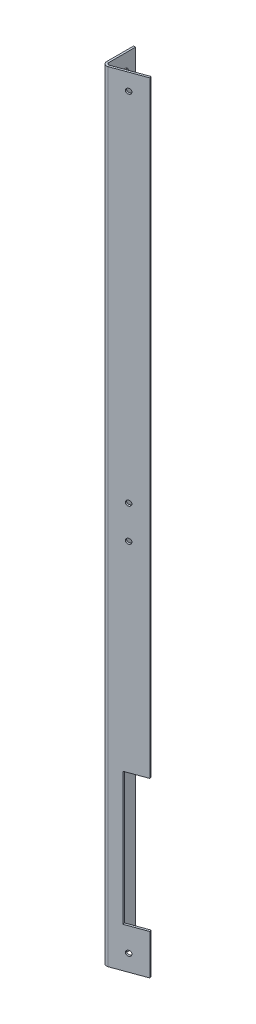
ISO-10303-21;
HEADER;
FILE_DESCRIPTION(('STEP AP214'),'2;1');
FILE_NAME('part.step','',(''),(''),'','','');
FILE_SCHEMA(('AUTOMOTIVE_DESIGN { 1 0 10303 214 1 1 1 1 }'));
ENDSEC;
DATA;
#1=APPLICATION_CONTEXT('core data for automotive mechanical design processes');
#2=APPLICATION_PROTOCOL_DEFINITION('international standard','automotive_design',2000,#1);
#3=PRODUCT_CONTEXT('',#1,'mechanical');
#4=PRODUCT('Part','Part','',(#3));
#5=PRODUCT_RELATED_PRODUCT_CATEGORY('part','',(#4));
#6=PRODUCT_DEFINITION_FORMATION('','',#4);
#7=PRODUCT_DEFINITION_CONTEXT('part definition',#1,'design');
#8=PRODUCT_DEFINITION('design','',#6,#7);
#9=PRODUCT_DEFINITION_SHAPE('','',#8);
#10=(LENGTH_UNIT() NAMED_UNIT(*) SI_UNIT(.MILLI.,.METRE.));
#11=(NAMED_UNIT(*) PLANE_ANGLE_UNIT() SI_UNIT($,.RADIAN.));
#12=(NAMED_UNIT(*) SI_UNIT($,.STERADIAN.) SOLID_ANGLE_UNIT());
#13=UNCERTAINTY_MEASURE_WITH_UNIT(LENGTH_MEASURE(1.E-05),#10,'distance_accuracy_value','');
#14=(GEOMETRIC_REPRESENTATION_CONTEXT(3) GLOBAL_UNCERTAINTY_ASSIGNED_CONTEXT((#13)) GLOBAL_UNIT_ASSIGNED_CONTEXT((#10,
#11,#12)) REPRESENTATION_CONTEXT('',''));
#15=CARTESIAN_POINT('',(0.,0.,0.));
#16=DIRECTION('',(0.,0.,1.));
#17=DIRECTION('',(1.,0.,0.));
#18=AXIS2_PLACEMENT_3D('',#15,#16,#17);
#19=CARTESIAN_POINT('',(2.49294013807537,0.,-1.4533113574662));
#20=DIRECTION('',(-0.342020143325673,0.,-0.939692620785907));
#21=DIRECTION('',(-0.939692620785907,0.,0.342020143325673));
#22=AXIS2_PLACEMENT_3D('',#19,#20,#21);
#23=PLANE('',#22);
#24=CARTESIAN_POINT('',(14.0511593737421,-12.7,-5.66015912037198));
#25=DIRECTION('',(0.342020143325673,0.,0.939692620785907));
#26=DIRECTION('',(0.939692620785907,0.,-0.342020143325673));
#27=AXIS2_PLACEMENT_3D('',#24,#25,#26);
#28=CIRCLE('',#27,2.);
#29=CARTESIAN_POINT('',(15.9305446153139,-12.7,-6.34419940702333));
#30=VERTEX_POINT('',#29);
#31=EDGE_CURVE('E320',#30,#30,#28,.T.);
#32=ORIENTED_EDGE('',*,*,#31,.F.);
#33=EDGE_LOOP('',(#32));
#34=FACE_BOUND('',#33,.T.);
#35=CARTESIAN_POINT('',(14.0511593737421,-287.3,-5.66015912037199));
#36=DIRECTION('',(0.342020143325673,0.,0.939692620785907));
#37=DIRECTION('',(0.939692620785907,0.,-0.342020143325673));
#38=AXIS2_PLACEMENT_3D('',#35,#36,#37);
#39=CIRCLE('',#38,2.);
#40=CARTESIAN_POINT('',(15.9305446153139,-287.3,-6.34419940702333));
#41=VERTEX_POINT('',#40);
#42=EDGE_CURVE('E327',#41,#41,#39,.T.);
#43=ORIENTED_EDGE('',*,*,#42,.F.);
#44=EDGE_LOOP('',(#43));
#45=FACE_BOUND('',#44,.T.);
#46=CARTESIAN_POINT('',(14.0511593737421,12.7,-5.66015912037198));
#47=DIRECTION('',(0.342020143325673,0.,0.939692620785907));
#48=DIRECTION('',(0.939692620785907,0.,-0.342020143325673));
#49=AXIS2_PLACEMENT_3D('',#46,#47,#48);
#50=CIRCLE('',#49,2.);
#51=CARTESIAN_POINT('',(15.9305446153139,12.7,-6.34419940702333));
#52=VERTEX_POINT('',#51);
#53=EDGE_CURVE('E340',#52,#52,#50,.T.);
#54=ORIENTED_EDGE('',*,*,#53,.F.);
#55=EDGE_LOOP('',(#54));
#56=FACE_BOUND('',#55,.T.);
#57=CARTESIAN_POINT('',(14.0511593737421,287.3,-5.66015912037199));
#58=DIRECTION('',(0.342020143325673,0.,0.939692620785907));
#59=DIRECTION('',(0.939692620785907,0.,-0.342020143325673));
#60=AXIS2_PLACEMENT_3D('',#57,#58,#59);
#61=CIRCLE('',#60,2.);
#62=CARTESIAN_POINT('',(15.9305446153139,287.3,-6.34419940702333));
#63=VERTEX_POINT('',#62);
#64=EDGE_CURVE('E343',#63,#63,#61,.T.);
#65=ORIENTED_EDGE('',*,*,#64,.F.);
#66=EDGE_LOOP('',(#65));
#67=FACE_BOUND('',#66,.T.);
#68=DIRECTION('',(0.939692620785907,0.,-0.342020143325673));
#69=VECTOR('',#68,1.);
#70=CARTESIAN_POINT('',(10.9501737251485,-167.,-4.53149264739725));
#71=LINE('',#70,#69);
#72=CARTESIAN_POINT('',(10.9501737251485,-167.,-4.53149264739725));
#73=VERTEX_POINT('',#72);
#74=CARTESIAN_POINT('',(25.9852556577231,-167.,-10.003814940608));
#75=VERTEX_POINT('',#74);
#76=EDGE_CURVE('E195',#73,#75,#71,.T.);
#77=ORIENTED_EDGE('',*,*,#76,.T.);
#78=DIRECTION('',(0.,-1.,0.));
#79=VECTOR('',#78,1.);
#80=CARTESIAN_POINT('',(25.985255657723,-300.,-10.003814940608));
#81=LINE('',#80,#79);
#82=CARTESIAN_POINT('',(25.985255657723,300.,-10.003814940608));
#83=VERTEX_POINT('',#82);
#84=EDGE_CURVE('E204',#83,#75,#81,.T.);
#85=ORIENTED_EDGE('',*,*,#84,.F.);
#86=DIRECTION('',(0.939692620785907,0.,-0.342020143325673));
#87=VECTOR('',#86,1.);
#88=CARTESIAN_POINT('',(25.985255657723,300.,-10.003814940608));
#89=LINE('',#88,#87);
#90=CARTESIAN_POINT('',(2.52606042997701,300.,-1.46536615786861));
#91=VERTEX_POINT('',#90);
#92=EDGE_CURVE('E93',#91,#83,#89,.T.);
#93=ORIENTED_EDGE('',*,*,#92,.F.);
#94=DIRECTION('',(0.,-1.,0.));
#95=VECTOR('',#94,1.);
#96=CARTESIAN_POINT('',(2.52606042997702,0.,-1.46536615786861));
#97=LINE('',#96,#95);
#98=CARTESIAN_POINT('',(2.52606042997702,-300.,-1.46536615786861));
#99=VERTEX_POINT('',#98);
#100=EDGE_CURVE('E226',#91,#99,#97,.T.);
#101=ORIENTED_EDGE('',*,*,#100,.T.);
#102=DIRECTION('',(-0.939692620785907,0.,0.342020143325673));
#103=VECTOR('',#102,1.);
#104=CARTESIAN_POINT('',(25.985255657723,-300.,-10.003814940608));
#105=LINE('',#104,#103);
#106=CARTESIAN_POINT('',(25.985255657723,-300.,-10.003814940608));
#107=VERTEX_POINT('',#106);
#108=EDGE_CURVE('E235',#107,#99,#105,.T.);
#109=ORIENTED_EDGE('',*,*,#108,.F.);
#110=CARTESIAN_POINT('',(25.9852556577231,-269.,-10.003814940608));
#111=VERTEX_POINT('',#110);
#112=EDGE_CURVE('E409',#111,#107,#81,.T.);
#113=ORIENTED_EDGE('',*,*,#112,.F.);
#114=DIRECTION('',(0.939692620785907,0.,-0.342020143325673));
#115=VECTOR('',#114,1.);
#116=CARTESIAN_POINT('',(10.9501737251485,-269.,-4.53149264739725));
#117=LINE('',#116,#115);
#118=CARTESIAN_POINT('',(10.9501737251485,-269.,-4.53149264739725));
#119=VERTEX_POINT('',#118);
#120=EDGE_CURVE('E391',#119,#111,#117,.T.);
#121=ORIENTED_EDGE('',*,*,#120,.F.);
#122=DIRECTION('',(0.,-1.,0.));
#123=VECTOR('',#122,1.);
#124=CARTESIAN_POINT('',(10.9501737251485,-167.,-4.53149264739725));
#125=LINE('',#124,#123);
#126=EDGE_CURVE('E388',#73,#119,#125,.T.);
#127=ORIENTED_EDGE('',*,*,#126,.F.);
#128=EDGE_LOOP('',(#77,#85,#93,#101,#109,#113,#121,#127));
#129=FACE_BOUND('',#128,.T.);
#130=ADVANCED_FACE('F88',(#34,#45,#56,#67,#129),#23,.F.);
#131=CARTESIAN_POINT('',(25.985255657723,-300.,-10.003814940608));
#132=DIRECTION('',(0.939692620785907,0.,-0.342020143325673));
#133=DIRECTION('',(0.,-1.,0.));
#134=AXIS2_PLACEMENT_3D('',#131,#132,#133);
#135=PLANE('',#134);
#136=ORIENTED_EDGE('',*,*,#84,.T.);
#137=DIRECTION('',(0.342020143325673,0.,0.939692620785907));
#138=VECTOR('',#137,1.);
#139=CARTESIAN_POINT('',(17.9499721650579,-167.,-32.0805748956216));
#140=LINE('',#139,#138);
#141=CARTESIAN_POINT('',(25.4722254427345,-167.,-11.4133538717869));
#142=VERTEX_POINT('',#141);
#143=EDGE_CURVE('E184',#142,#75,#140,.T.);
#144=ORIENTED_EDGE('',*,*,#143,.F.);
#145=DIRECTION('',(0.,-1.,0.));
#146=VECTOR('',#145,1.);
#147=CARTESIAN_POINT('',(25.4722254427345,-300.,-11.4133538717869));
#148=LINE('',#147,#146);
#149=CARTESIAN_POINT('',(25.4722254427345,300.,-11.4133538717869));
#150=VERTEX_POINT('',#149);
#151=EDGE_CURVE('E199',#150,#142,#148,.T.);
#152=ORIENTED_EDGE('',*,*,#151,.F.);
#153=DIRECTION('',(-0.342020143325673,0.,-0.939692620785907));
#154=VECTOR('',#153,1.);
#155=CARTESIAN_POINT('',(25.985255657723,300.,-10.003814940608));
#156=LINE('',#155,#154);
#157=EDGE_CURVE('E230',#83,#150,#156,.T.);
#158=ORIENTED_EDGE('',*,*,#157,.F.);
#159=EDGE_LOOP('',(#136,#144,#152,#158));
#160=FACE_BOUND('',#159,.T.);
#161=ADVANCED_FACE('F196',(#160),#135,.T.);
#162=CARTESIAN_POINT('',(1.97990992308686,0.,-2.86285028864506));
#163=DIRECTION('',(-0.342020143325673,0.,-0.939692620785907));
#164=DIRECTION('',(-0.939692620785907,0.,0.342020143325673));
#165=AXIS2_PLACEMENT_3D('',#162,#163,#164);
#166=PLANE('',#165);
#167=CARTESIAN_POINT('',(13.5381291587536,287.3,-7.06969805155085));
#168=DIRECTION('',(-0.342020143325673,0.,-0.939692620785907));
#169=DIRECTION('',(-0.939692620785907,0.,0.342020143325673));
#170=AXIS2_PLACEMENT_3D('',#167,#168,#169);
#171=CIRCLE('',#170,2.);
#172=CARTESIAN_POINT('',(11.6587439171817,287.3,-6.3856577648995));
#173=VERTEX_POINT('',#172);
#174=EDGE_CURVE('E342',#173,#173,#171,.T.);
#175=ORIENTED_EDGE('',*,*,#174,.F.);
#176=EDGE_LOOP('',(#175));
#177=FACE_BOUND('',#176,.T.);
#178=CARTESIAN_POINT('',(13.5381291587536,12.7,-7.06969805155085));
#179=DIRECTION('',(-0.342020143325673,0.,-0.939692620785907));
#180=DIRECTION('',(-0.939692620785907,0.,0.342020143325673));
#181=AXIS2_PLACEMENT_3D('',#178,#179,#180);
#182=CIRCLE('',#181,2.);
#183=CARTESIAN_POINT('',(11.6587439171817,12.7,-6.3856577648995));
#184=VERTEX_POINT('',#183);
#185=EDGE_CURVE('E332',#184,#184,#182,.T.);
#186=ORIENTED_EDGE('',*,*,#185,.F.);
#187=EDGE_LOOP('',(#186));
#188=FACE_BOUND('',#187,.T.);
#189=CARTESIAN_POINT('',(13.5381291587536,-287.3,-7.06969805155085));
#190=DIRECTION('',(-0.342020143325673,0.,-0.939692620785907));
#191=DIRECTION('',(-0.939692620785907,0.,0.342020143325673));
#192=AXIS2_PLACEMENT_3D('',#189,#190,#191);
#193=CIRCLE('',#192,2.);
#194=CARTESIAN_POINT('',(11.6587439171817,-287.3,-6.3856577648995));
#195=VERTEX_POINT('',#194);
#196=EDGE_CURVE('E324',#195,#195,#193,.T.);
#197=ORIENTED_EDGE('',*,*,#196,.F.);
#198=EDGE_LOOP('',(#197));
#199=FACE_BOUND('',#198,.T.);
#200=CARTESIAN_POINT('',(13.5381291587536,-12.7,-7.06969805155085));
#201=DIRECTION('',(-0.342020143325673,0.,-0.939692620785907));
#202=DIRECTION('',(-0.939692620785907,0.,0.342020143325673));
#203=AXIS2_PLACEMENT_3D('',#200,#201,#202);
#204=CIRCLE('',#203,2.);
#205=CARTESIAN_POINT('',(11.6587439171817,-12.7,-6.3856577648995));
#206=VERTEX_POINT('',#205);
#207=EDGE_CURVE('E308',#206,#206,#204,.T.);
#208=ORIENTED_EDGE('',*,*,#207,.F.);
#209=EDGE_LOOP('',(#208));
#210=FACE_BOUND('',#209,.T.);
#211=ORIENTED_EDGE('',*,*,#151,.T.);
#212=DIRECTION('',(0.939692620785907,0.,-0.342020143325673));
#213=VECTOR('',#212,1.);
#214=CARTESIAN_POINT('',(10.43714351016,-167.,-5.94103157857611));
#215=LINE('',#214,#213);
#216=CARTESIAN_POINT('',(10.43714351016,-167.,-5.94103157857611));
#217=VERTEX_POINT('',#216);
#218=EDGE_CURVE('E181',#217,#142,#215,.T.);
#219=ORIENTED_EDGE('',*,*,#218,.F.);
#220=DIRECTION('',(0.,-1.,0.));
#221=VECTOR('',#220,1.);
#222=CARTESIAN_POINT('',(10.43714351016,-167.,-5.94103157857611));
#223=LINE('',#222,#221);
#224=CARTESIAN_POINT('',(10.43714351016,-269.,-5.94103157857611));
#225=VERTEX_POINT('',#224);
#226=EDGE_CURVE('E205',#217,#225,#223,.T.);
#227=ORIENTED_EDGE('',*,*,#226,.T.);
#228=DIRECTION('',(0.939692620785907,0.,-0.342020143325673));
#229=VECTOR('',#228,1.);
#230=CARTESIAN_POINT('',(10.43714351016,-269.,-5.94103157857611));
#231=LINE('',#230,#229);
#232=CARTESIAN_POINT('',(25.4722254427345,-269.,-11.4133538717869));
#233=VERTEX_POINT('',#232);
#234=EDGE_CURVE('E194',#225,#233,#231,.T.);
#235=ORIENTED_EDGE('',*,*,#234,.T.);
#236=CARTESIAN_POINT('',(25.4722254427345,-300.,-11.4133538717869));
#237=VERTEX_POINT('',#236);
#238=EDGE_CURVE('E211',#233,#237,#148,.T.);
#239=ORIENTED_EDGE('',*,*,#238,.T.);
#240=DIRECTION('',(-0.939692620785907,0.,0.342020143325673));
#241=VECTOR('',#240,1.);
#242=CARTESIAN_POINT('',(25.4722254427345,-300.,-11.4133538717869));
#243=LINE('',#242,#241);
#244=CARTESIAN_POINT('',(2.01303021498851,-300.,-2.87490508904746));
#245=VERTEX_POINT('',#244);
#246=EDGE_CURVE('E214',#237,#245,#243,.T.);
#247=ORIENTED_EDGE('',*,*,#246,.T.);
#248=DIRECTION('',(0.,-1.,0.));
#249=VECTOR('',#248,1.);
#250=CARTESIAN_POINT('',(2.01303021498851,0.,-2.87490508904747));
#251=LINE('',#250,#249);
#252=CARTESIAN_POINT('',(2.01303021498851,300.,-2.87490508904747));
#253=VERTEX_POINT('',#252);
#254=EDGE_CURVE('E99',#253,#245,#251,.T.);
#255=ORIENTED_EDGE('',*,*,#254,.F.);
#256=DIRECTION('',(0.939692620785907,0.,-0.342020143325673));
#257=VECTOR('',#256,1.);
#258=CARTESIAN_POINT('',(25.4722254427345,300.,-11.4133538717869));
#259=LINE('',#258,#257);
#260=EDGE_CURVE('E208',#253,#150,#259,.T.);
#261=ORIENTED_EDGE('',*,*,#260,.T.);
#262=EDGE_LOOP('',(#211,#219,#227,#235,#239,#247,#255,#261));
#263=FACE_BOUND('',#262,.T.);
#264=ADVANCED_FACE('F210',(#177,#188,#199,#210,#263),#166,.T.);
#265=CARTESIAN_POINT('',(25.985255657723,300.,-10.003814940608));
#266=DIRECTION('',(0.,1.,0.));
#267=DIRECTION('',(0.939692620785907,0.,-0.342020143325673));
#268=AXIS2_PLACEMENT_3D('',#265,#266,#267);
#269=PLANE('',#268);
#270=DIRECTION('',(-0.342020143325673,0.,-0.939692620785907));
#271=VECTOR('',#270,1.);
#272=CARTESIAN_POINT('',(2.52606042997702,300.,-1.46536615786861));
#273=LINE('',#272,#271);
#274=EDGE_CURVE('E236',#91,#253,#273,.T.);
#275=ORIENTED_EDGE('',*,*,#274,.F.);
#276=ORIENTED_EDGE('',*,*,#92,.T.);
#277=ORIENTED_EDGE('',*,*,#157,.T.);
#278=ORIENTED_EDGE('',*,*,#260,.F.);
#279=EDGE_LOOP('',(#275,#276,#277,#278));
#280=FACE_BOUND('',#279,.T.);
#281=ADVANCED_FACE('F460',(#280),#269,.T.);
#282=CARTESIAN_POINT('',(25.985255657723,-300.,-10.003814940608));
#283=DIRECTION('',(0.,-1.,0.));
#284=DIRECTION('',(-0.939692620785907,0.,0.342020143325673));
#285=AXIS2_PLACEMENT_3D('',#282,#283,#284);
#286=PLANE('',#285);
#287=DIRECTION('',(0.342020143325673,0.,0.939692620785907));
#288=VECTOR('',#287,1.);
#289=CARTESIAN_POINT('',(2.52606042997702,-300.,-1.4653661578686));
#290=LINE('',#289,#288);
#291=EDGE_CURVE('E12',#245,#99,#290,.T.);
#292=ORIENTED_EDGE('',*,*,#291,.F.);
#293=ORIENTED_EDGE('',*,*,#246,.F.);
#294=DIRECTION('',(-0.342020143325673,0.,-0.939692620785907));
#295=VECTOR('',#294,1.);
#296=CARTESIAN_POINT('',(25.985255657723,-300.,-10.003814940608));
#297=LINE('',#296,#295);
#298=EDGE_CURVE('E223',#107,#237,#297,.T.);
#299=ORIENTED_EDGE('',*,*,#298,.F.);
#300=ORIENTED_EDGE('',*,*,#108,.T.);
#301=EDGE_LOOP('',(#292,#293,#299,#300));
#302=FACE_BOUND('',#301,.T.);
#303=ADVANCED_FACE('F92',(#302),#286,.T.);
#304=DIRECTION('',(0.342020143325673,0.,0.939692620785907));
#305=VECTOR('',#304,1.);
#306=CARTESIAN_POINT('',(17.9499721650579,-269.,-32.0805748956216));
#307=LINE('',#306,#305);
#308=EDGE_CURVE('E201',#233,#111,#307,.T.);
#309=ORIENTED_EDGE('',*,*,#308,.T.);
#310=ORIENTED_EDGE('',*,*,#112,.T.);
#311=ORIENTED_EDGE('',*,*,#298,.T.);
#312=ORIENTED_EDGE('',*,*,#238,.F.);
#313=EDGE_LOOP('',(#309,#310,#311,#312));
#314=FACE_BOUND('',#313,.T.);
#315=ADVANCED_FACE('F404',(#314),#135,.T.);
#316=CARTESIAN_POINT('',(-1.5,-300.,-25.));
#317=DIRECTION('',(0.,0.,-1.));
#318=DIRECTION('',(-1.,0.,0.));
#319=AXIS2_PLACEMENT_3D('',#316,#317,#318);
#320=PLANE('',#319);
#321=DIRECTION('',(0.,1.,0.));
#322=VECTOR('',#321,1.);
#323=CARTESIAN_POINT('',(0.,-300.,-25.));
#324=LINE('',#323,#322);
#325=CARTESIAN_POINT('',(0.,-300.,-25.));
#326=VERTEX_POINT('',#325);
#327=CARTESIAN_POINT('',(0.,300.,-25.));
#328=VERTEX_POINT('',#327);
#329=EDGE_CURVE('E264',#326,#328,#324,.T.);
#330=ORIENTED_EDGE('',*,*,#329,.F.);
#331=DIRECTION('',(1.,0.,0.));
#332=VECTOR('',#331,1.);
#333=CARTESIAN_POINT('',(-1.5,-300.,-25.));
#334=LINE('',#333,#332);
#335=CARTESIAN_POINT('',(-1.5,-300.,-25.));
#336=VERTEX_POINT('',#335);
#337=EDGE_CURVE('E242',#336,#326,#334,.T.);
#338=ORIENTED_EDGE('',*,*,#337,.F.);
#339=DIRECTION('',(0.,1.,0.));
#340=VECTOR('',#339,1.);
#341=CARTESIAN_POINT('',(-1.5,-300.,-25.));
#342=LINE('',#341,#340);
#343=CARTESIAN_POINT('',(-1.5,300.,-25.));
#344=VERTEX_POINT('',#343);
#345=EDGE_CURVE('E293',#336,#344,#342,.T.);
#346=ORIENTED_EDGE('',*,*,#345,.T.);
#347=DIRECTION('',(1.,0.,0.));
#348=VECTOR('',#347,1.);
#349=CARTESIAN_POINT('',(-1.5,300.,-25.));
#350=LINE('',#349,#348);
#351=EDGE_CURVE('E289',#344,#328,#350,.T.);
#352=ORIENTED_EDGE('',*,*,#351,.T.);
#353=EDGE_LOOP('',(#330,#338,#346,#352));
#354=FACE_BOUND('',#353,.T.);
#355=ADVANCED_FACE('F433',(#354),#320,.T.);
#356=CARTESIAN_POINT('',(-1.5,0.,0.));
#357=DIRECTION('',(1.,0.,0.));
#358=DIRECTION('',(0.,0.,-1.));
#359=AXIS2_PLACEMENT_3D('',#356,#357,#358);
#360=PLANE('',#359);
#361=CARTESIAN_POINT('',(-1.5,287.3,-16.9844440202263));
#362=DIRECTION('',(-1.,0.,0.));
#363=DIRECTION('',(0.,0.,1.));
#364=AXIS2_PLACEMENT_3D('',#361,#362,#363);
#365=CIRCLE('',#364,2.5);
#366=CARTESIAN_POINT('',(-1.5,287.3,-14.4844440202263));
#367=VERTEX_POINT('',#366);
#368=EDGE_CURVE('E380',#367,#367,#365,.T.);
#369=ORIENTED_EDGE('',*,*,#368,.F.);
#370=EDGE_LOOP('',(#369));
#371=FACE_BOUND('',#370,.T.);
#372=CARTESIAN_POINT('',(-1.5,87.2999999999999,-16.9844440202263));
#373=DIRECTION('',(-1.,0.,0.));
#374=DIRECTION('',(0.,0.,1.));
#375=AXIS2_PLACEMENT_3D('',#372,#373,#374);
#376=CIRCLE('',#375,2.5);
#377=CARTESIAN_POINT('',(-1.5,87.2999999999999,-14.4844440202263));
#378=VERTEX_POINT('',#377);
#379=EDGE_CURVE('E367',#378,#378,#376,.T.);
#380=ORIENTED_EDGE('',*,*,#379,.F.);
#381=EDGE_LOOP('',(#380));
#382=FACE_BOUND('',#381,.T.);
#383=CARTESIAN_POINT('',(-1.5,-87.3,-16.9844440202263));
#384=DIRECTION('',(-1.,0.,0.));
#385=DIRECTION('',(0.,0.,1.));
#386=AXIS2_PLACEMENT_3D('',#383,#384,#385);
#387=CIRCLE('',#386,2.5);
#388=CARTESIAN_POINT('',(-1.5,-87.3,-14.4844440202263));
#389=VERTEX_POINT('',#388);
#390=EDGE_CURVE('E363',#389,#389,#387,.T.);
#391=ORIENTED_EDGE('',*,*,#390,.F.);
#392=EDGE_LOOP('',(#391));
#393=FACE_BOUND('',#392,.T.);
#394=CARTESIAN_POINT('',(-1.5,-287.3,-16.9844440202263));
#395=DIRECTION('',(-1.,0.,0.));
#396=DIRECTION('',(0.,0.,1.));
#397=AXIS2_PLACEMENT_3D('',#394,#395,#396);
#398=CIRCLE('',#397,2.5);
#399=CARTESIAN_POINT('',(-1.5,-287.3,-14.4844440202263));
#400=VERTEX_POINT('',#399);
#401=EDGE_CURVE('E354',#400,#400,#398,.T.);
#402=ORIENTED_EDGE('',*,*,#401,.F.);
#403=EDGE_LOOP('',(#402));
#404=FACE_BOUND('',#403,.T.);
#405=DIRECTION('',(0.,-1.,0.));
#406=VECTOR('',#405,1.);
#407=CARTESIAN_POINT('',(-1.5,0.,-4.28444402022633));
#408=LINE('',#407,#406);
#409=CARTESIAN_POINT('',(-1.5,300.,-4.28444402022633));
#410=VERTEX_POINT('',#409);
#411=CARTESIAN_POINT('',(-1.5,-300.,-4.28444402022632));
#412=VERTEX_POINT('',#411);
#413=EDGE_CURVE('E295',#410,#412,#408,.T.);
#414=ORIENTED_EDGE('',*,*,#413,.F.);
#415=DIRECTION('',(0.,0.,1.));
#416=VECTOR('',#415,1.);
#417=CARTESIAN_POINT('',(-1.5,300.,25.));
#418=LINE('',#417,#416);
#419=EDGE_CURVE('E281',#344,#410,#418,.T.);
#420=ORIENTED_EDGE('',*,*,#419,.F.);
#421=ORIENTED_EDGE('',*,*,#345,.F.);
#422=DIRECTION('',(0.,0.,-1.));
#423=VECTOR('',#422,1.);
#424=CARTESIAN_POINT('',(-1.5,-300.,25.));
#425=LINE('',#424,#423);
#426=EDGE_CURVE('E247',#412,#336,#425,.T.);
#427=ORIENTED_EDGE('',*,*,#426,.F.);
#428=EDGE_LOOP('',(#414,#420,#421,#427));
#429=FACE_BOUND('',#428,.T.);
#430=ADVANCED_FACE('F427',(#371,#382,#393,#404,#429),#360,.F.);
#431=CARTESIAN_POINT('',(-1.5,300.,25.));
#432=DIRECTION('',(0.,1.,0.));
#433=DIRECTION('',(0.,0.,1.));
#434=AXIS2_PLACEMENT_3D('',#431,#432,#433);
#435=PLANE('',#434);
#436=ORIENTED_EDGE('',*,*,#419,.T.);
#437=DIRECTION('',(1.,0.,0.));
#438=VECTOR('',#437,1.);
#439=CARTESIAN_POINT('',(-1.5,300.,-4.28444402022633));
#440=LINE('',#439,#438);
#441=CARTESIAN_POINT('',(0.,300.,-4.28444402022633));
#442=VERTEX_POINT('',#441);
#443=EDGE_CURVE('E278',#410,#442,#440,.T.);
#444=ORIENTED_EDGE('',*,*,#443,.T.);
#445=DIRECTION('',(0.,0.,1.));
#446=VECTOR('',#445,1.);
#447=CARTESIAN_POINT('',(0.,300.,25.));
#448=LINE('',#447,#446);
#449=EDGE_CURVE('E277',#328,#442,#448,.T.);
#450=ORIENTED_EDGE('',*,*,#449,.F.);
#451=ORIENTED_EDGE('',*,*,#351,.F.);
#452=EDGE_LOOP('',(#436,#444,#450,#451));
#453=FACE_BOUND('',#452,.T.);
#454=ADVANCED_FACE('F421',(#453),#435,.T.);
#455=CARTESIAN_POINT('',(0.,0.,0.));
#456=DIRECTION('',(1.,0.,0.));
#457=DIRECTION('',(0.,0.,-1.));
#458=AXIS2_PLACEMENT_3D('',#455,#456,#457);
#459=PLANE('',#458);
#460=CARTESIAN_POINT('',(0.,287.3,-16.9844440202263));
#461=DIRECTION('',(1.,0.,0.));
#462=DIRECTION('',(0.,0.,-1.));
#463=AXIS2_PLACEMENT_3D('',#460,#461,#462);
#464=CIRCLE('',#463,2.5);
#465=CARTESIAN_POINT('',(0.,287.3,-19.4844440202263));
#466=VERTEX_POINT('',#465);
#467=EDGE_CURVE('E373',#466,#466,#464,.T.);
#468=ORIENTED_EDGE('',*,*,#467,.F.);
#469=EDGE_LOOP('',(#468));
#470=FACE_BOUND('',#469,.T.);
#471=CARTESIAN_POINT('',(0.,87.2999999999999,-16.9844440202263));
#472=DIRECTION('',(1.,0.,0.));
#473=DIRECTION('',(0.,0.,-1.));
#474=AXIS2_PLACEMENT_3D('',#471,#472,#473);
#475=CIRCLE('',#474,2.5);
#476=CARTESIAN_POINT('',(0.,87.2999999999999,-19.4844440202263));
#477=VERTEX_POINT('',#476);
#478=EDGE_CURVE('E362',#477,#477,#475,.T.);
#479=ORIENTED_EDGE('',*,*,#478,.F.);
#480=EDGE_LOOP('',(#479));
#481=FACE_BOUND('',#480,.T.);
#482=CARTESIAN_POINT('',(0.,-87.3,-16.9844440202263));
#483=DIRECTION('',(1.,0.,0.));
#484=DIRECTION('',(0.,0.,-1.));
#485=AXIS2_PLACEMENT_3D('',#482,#483,#484);
#486=CIRCLE('',#485,2.5);
#487=CARTESIAN_POINT('',(0.,-87.3,-19.4844440202263));
#488=VERTEX_POINT('',#487);
#489=EDGE_CURVE('E357',#488,#488,#486,.T.);
#490=ORIENTED_EDGE('',*,*,#489,.F.);
#491=EDGE_LOOP('',(#490));
#492=FACE_BOUND('',#491,.T.);
#493=CARTESIAN_POINT('',(0.,-287.3,-16.9844440202263));
#494=DIRECTION('',(1.,0.,0.));
#495=DIRECTION('',(0.,0.,-1.));
#496=AXIS2_PLACEMENT_3D('',#493,#494,#495);
#497=CIRCLE('',#496,2.5);
#498=CARTESIAN_POINT('',(0.,-287.3,-19.4844440202263));
#499=VERTEX_POINT('',#498);
#500=EDGE_CURVE('E346',#499,#499,#497,.T.);
#501=ORIENTED_EDGE('',*,*,#500,.F.);
#502=EDGE_LOOP('',(#501));
#503=FACE_BOUND('',#502,.T.);
#504=ORIENTED_EDGE('',*,*,#449,.T.);
#505=DIRECTION('',(0.,-1.,0.));
#506=VECTOR('',#505,1.);
#507=CARTESIAN_POINT('',(0.,0.,-4.28444402022633));
#508=LINE('',#507,#506);
#509=CARTESIAN_POINT('',(0.,-300.,-4.28444402022632));
#510=VERTEX_POINT('',#509);
#511=EDGE_CURVE('E275',#442,#510,#508,.T.);
#512=ORIENTED_EDGE('',*,*,#511,.T.);
#513=DIRECTION('',(0.,0.,-1.));
#514=VECTOR('',#513,1.);
#515=CARTESIAN_POINT('',(0.,-300.,25.));
#516=LINE('',#515,#514);
#517=EDGE_CURVE('E270',#510,#326,#516,.T.);
#518=ORIENTED_EDGE('',*,*,#517,.T.);
#519=ORIENTED_EDGE('',*,*,#329,.T.);
#520=EDGE_LOOP('',(#504,#512,#518,#519));
#521=FACE_BOUND('',#520,.T.);
#522=ADVANCED_FACE('F420',(#470,#481,#492,#503,#521),#459,.T.);
#523=CARTESIAN_POINT('',(-1.5,-300.,25.));
#524=DIRECTION('',(0.,-1.,0.));
#525=DIRECTION('',(0.,0.,-1.));
#526=AXIS2_PLACEMENT_3D('',#523,#524,#525);
#527=PLANE('',#526);
#528=ORIENTED_EDGE('',*,*,#517,.F.);
#529=DIRECTION('',(-1.,0.,0.));
#530=VECTOR('',#529,1.);
#531=CARTESIAN_POINT('',(-1.5,-300.,-4.28444402022632));
#532=LINE('',#531,#530);
#533=EDGE_CURVE('E257',#510,#412,#532,.T.);
#534=ORIENTED_EDGE('',*,*,#533,.T.);
#535=ORIENTED_EDGE('',*,*,#426,.T.);
#536=ORIENTED_EDGE('',*,*,#337,.T.);
#537=EDGE_LOOP('',(#528,#534,#535,#536));
#538=FACE_BOUND('',#537,.T.);
#539=ADVANCED_FACE('F419',(#538),#527,.T.);
#540=CARTESIAN_POINT('',(1.5,300.,-4.28444402022633));
#541=DIRECTION('',(0.,1.,0.));
#542=DIRECTION('',(0.,0.,1.));
#543=AXIS2_PLACEMENT_3D('',#540,#541,#542);
#544=PLANE('',#543);
#545=ORIENTED_EDGE('',*,*,#274,.T.);
#546=CARTESIAN_POINT('',(1.5,300.,-4.28444402022633));
#547=DIRECTION('',(0.,1.,0.));
#548=DIRECTION('',(0.,0.,1.));
#549=AXIS2_PLACEMENT_3D('',#546,#547,#548);
#550=CIRCLE('',#549,1.5);
#551=EDGE_CURVE('E306',#253,#442,#550,.F.);
#552=ORIENTED_EDGE('',*,*,#551,.T.);
#553=ORIENTED_EDGE('',*,*,#443,.F.);
#554=CARTESIAN_POINT('',(1.5,300.,-4.28444402022633));
#555=DIRECTION('',(0.,-1.,0.));
#556=DIRECTION('',(0.,0.,1.));
#557=AXIS2_PLACEMENT_3D('',#554,#555,#556);
#558=CIRCLE('',#557,3.);
#559=EDGE_CURVE('E297',#91,#410,#558,.T.);
#560=ORIENTED_EDGE('',*,*,#559,.F.);
#561=EDGE_LOOP('',(#545,#552,#553,#560));
#562=FACE_BOUND('',#561,.T.);
#563=ADVANCED_FACE('F428',(#562),#544,.T.);
#564=CARTESIAN_POINT('',(1.5,-300.,-4.28444402022632));
#565=DIRECTION('',(0.,-1.,0.));
#566=DIRECTION('',(0.,0.,-1.));
#567=AXIS2_PLACEMENT_3D('',#564,#565,#566);
#568=PLANE('',#567);
#569=CARTESIAN_POINT('',(1.5,-300.,-4.28444402022632));
#570=DIRECTION('',(0.,1.,0.));
#571=DIRECTION('',(0.,0.,1.));
#572=AXIS2_PLACEMENT_3D('',#569,#570,#571);
#573=CIRCLE('',#572,1.5);
#574=EDGE_CURVE('E256',#510,#245,#573,.T.);
#575=ORIENTED_EDGE('',*,*,#574,.T.);
#576=ORIENTED_EDGE('',*,*,#291,.T.);
#577=CARTESIAN_POINT('',(1.5,-300.,-4.28444402022632));
#578=DIRECTION('',(0.,1.,0.));
#579=DIRECTION('',(0.,0.,-1.));
#580=AXIS2_PLACEMENT_3D('',#577,#578,#579);
#581=CIRCLE('',#580,3.);
#582=EDGE_CURVE('E116',#412,#99,#581,.T.);
#583=ORIENTED_EDGE('',*,*,#582,.F.);
#584=ORIENTED_EDGE('',*,*,#533,.F.);
#585=EDGE_LOOP('',(#575,#576,#583,#584));
#586=FACE_BOUND('',#585,.T.);
#587=ADVANCED_FACE('F416',(#586),#568,.T.);
#588=CARTESIAN_POINT('',(1.5,-600.017424514339,-4.28444402022632));
#589=DIRECTION('',(0.,1.,0.));
#590=DIRECTION('',(0.,0.,1.));
#591=AXIS2_PLACEMENT_3D('',#588,#589,#590);
#592=CYLINDRICAL_SURFACE('',#591,3.);
#593=ORIENTED_EDGE('',*,*,#413,.T.);
#594=ORIENTED_EDGE('',*,*,#582,.T.);
#595=ORIENTED_EDGE('',*,*,#100,.F.);
#596=ORIENTED_EDGE('',*,*,#559,.T.);
#597=EDGE_LOOP('',(#593,#594,#595,#596));
#598=FACE_BOUND('',#597,.T.);
#599=ADVANCED_FACE('F426',(#598),#592,.T.);
#600=CARTESIAN_POINT('',(1.5,-600.017424514339,-4.28444402022632));
#601=DIRECTION('',(0.,1.,0.));
#602=DIRECTION('',(0.,0.,1.));
#603=AXIS2_PLACEMENT_3D('',#600,#601,#602);
#604=CYLINDRICAL_SURFACE('',#603,1.5);
#605=ORIENTED_EDGE('',*,*,#511,.F.);
#606=ORIENTED_EDGE('',*,*,#551,.F.);
#607=ORIENTED_EDGE('',*,*,#254,.T.);
#608=ORIENTED_EDGE('',*,*,#574,.F.);
#609=EDGE_LOOP('',(#605,#606,#607,#608));
#610=FACE_BOUND('',#609,.T.);
#611=ADVANCED_FACE('F411',(#610),#604,.F.);
#612=CARTESIAN_POINT('',(14.0511593737421,-12.7,-5.66015912037198));
#613=DIRECTION('',(0.342020143325673,0.,0.939692620785907));
#614=DIRECTION('',(0.939692620785907,0.,-0.342020143325673));
#615=AXIS2_PLACEMENT_3D('',#612,#613,#614);
#616=CYLINDRICAL_SURFACE('',#615,2.);
#617=ORIENTED_EDGE('',*,*,#31,.T.);
#618=EDGE_LOOP('',(#617));
#619=FACE_BOUND('',#618,.T.);
#620=ORIENTED_EDGE('',*,*,#207,.T.);
#621=EDGE_LOOP('',(#620));
#622=FACE_BOUND('',#621,.T.);
#623=ADVANCED_FACE('F471',(#619,#622),#616,.F.);
#624=CARTESIAN_POINT('',(14.0511593737421,-287.3,-5.66015912037199));
#625=DIRECTION('',(0.342020143325673,0.,0.939692620785907));
#626=DIRECTION('',(0.939692620785907,0.,-0.342020143325673));
#627=AXIS2_PLACEMENT_3D('',#624,#625,#626);
#628=CYLINDRICAL_SURFACE('',#627,2.);
#629=ORIENTED_EDGE('',*,*,#42,.T.);
#630=EDGE_LOOP('',(#629));
#631=FACE_BOUND('',#630,.T.);
#632=ORIENTED_EDGE('',*,*,#196,.T.);
#633=EDGE_LOOP('',(#632));
#634=FACE_BOUND('',#633,.T.);
#635=ADVANCED_FACE('F472',(#631,#634),#628,.F.);
#636=CARTESIAN_POINT('',(14.0511593737421,12.7,-5.66015912037198));
#637=DIRECTION('',(0.342020143325673,0.,0.939692620785907));
#638=DIRECTION('',(0.939692620785907,0.,-0.342020143325673));
#639=AXIS2_PLACEMENT_3D('',#636,#637,#638);
#640=CYLINDRICAL_SURFACE('',#639,2.);
#641=ORIENTED_EDGE('',*,*,#53,.T.);
#642=EDGE_LOOP('',(#641));
#643=FACE_BOUND('',#642,.T.);
#644=ORIENTED_EDGE('',*,*,#185,.T.);
#645=EDGE_LOOP('',(#644));
#646=FACE_BOUND('',#645,.T.);
#647=ADVANCED_FACE('F474',(#643,#646),#640,.F.);
#648=CARTESIAN_POINT('',(14.0511593737421,287.3,-5.66015912037199));
#649=DIRECTION('',(0.342020143325673,0.,0.939692620785907));
#650=DIRECTION('',(0.939692620785907,0.,-0.342020143325673));
#651=AXIS2_PLACEMENT_3D('',#648,#649,#650);
#652=CYLINDRICAL_SURFACE('',#651,2.);
#653=ORIENTED_EDGE('',*,*,#64,.T.);
#654=EDGE_LOOP('',(#653));
#655=FACE_BOUND('',#654,.T.);
#656=ORIENTED_EDGE('',*,*,#174,.T.);
#657=EDGE_LOOP('',(#656));
#658=FACE_BOUND('',#657,.T.);
#659=ADVANCED_FACE('F481',(#655,#658),#652,.F.);
#660=CARTESIAN_POINT('',(-1.5,-287.3,-16.9844440202263));
#661=DIRECTION('',(-1.,0.,0.));
#662=DIRECTION('',(0.,0.,1.));
#663=AXIS2_PLACEMENT_3D('',#660,#661,#662);
#664=CYLINDRICAL_SURFACE('',#663,2.5);
#665=ORIENTED_EDGE('',*,*,#401,.T.);
#666=EDGE_LOOP('',(#665));
#667=FACE_BOUND('',#666,.T.);
#668=ORIENTED_EDGE('',*,*,#500,.T.);
#669=EDGE_LOOP('',(#668));
#670=FACE_BOUND('',#669,.T.);
#671=ADVANCED_FACE('F534',(#667,#670),#664,.F.);
#672=CARTESIAN_POINT('',(-1.5,-87.3,-16.9844440202263));
#673=DIRECTION('',(-1.,0.,0.));
#674=DIRECTION('',(0.,0.,1.));
#675=AXIS2_PLACEMENT_3D('',#672,#673,#674);
#676=CYLINDRICAL_SURFACE('',#675,2.5);
#677=ORIENTED_EDGE('',*,*,#390,.T.);
#678=EDGE_LOOP('',(#677));
#679=FACE_BOUND('',#678,.T.);
#680=ORIENTED_EDGE('',*,*,#489,.T.);
#681=EDGE_LOOP('',(#680));
#682=FACE_BOUND('',#681,.T.);
#683=ADVANCED_FACE('F545',(#679,#682),#676,.F.);
#684=CARTESIAN_POINT('',(-1.5,87.2999999999999,-16.9844440202263));
#685=DIRECTION('',(-1.,0.,0.));
#686=DIRECTION('',(0.,0.,1.));
#687=AXIS2_PLACEMENT_3D('',#684,#685,#686);
#688=CYLINDRICAL_SURFACE('',#687,2.5);
#689=ORIENTED_EDGE('',*,*,#379,.T.);
#690=EDGE_LOOP('',(#689));
#691=FACE_BOUND('',#690,.T.);
#692=ORIENTED_EDGE('',*,*,#478,.T.);
#693=EDGE_LOOP('',(#692));
#694=FACE_BOUND('',#693,.T.);
#695=ADVANCED_FACE('F555',(#691,#694),#688,.F.);
#696=CARTESIAN_POINT('',(-1.5,287.3,-16.9844440202263));
#697=DIRECTION('',(-1.,0.,0.));
#698=DIRECTION('',(0.,0.,1.));
#699=AXIS2_PLACEMENT_3D('',#696,#697,#698);
#700=CYLINDRICAL_SURFACE('',#699,2.5);
#701=ORIENTED_EDGE('',*,*,#368,.T.);
#702=EDGE_LOOP('',(#701));
#703=FACE_BOUND('',#702,.T.);
#704=ORIENTED_EDGE('',*,*,#467,.T.);
#705=EDGE_LOOP('',(#704));
#706=FACE_BOUND('',#705,.T.);
#707=ADVANCED_FACE('F562',(#703,#706),#700,.F.);
#708=CARTESIAN_POINT('',(2.91489023248342,-167.,-26.6082526024109));
#709=DIRECTION('',(0.,-1.,0.));
#710=DIRECTION('',(0.,0.,-1.));
#711=AXIS2_PLACEMENT_3D('',#708,#709,#710);
#712=PLANE('',#711);
#713=ORIENTED_EDGE('',*,*,#218,.T.);
#714=ORIENTED_EDGE('',*,*,#143,.T.);
#715=ORIENTED_EDGE('',*,*,#76,.F.);
#716=DIRECTION('',(0.342020143325673,0.,0.939692620785907));
#717=VECTOR('',#716,1.);
#718=CARTESIAN_POINT('',(2.91489023248342,-167.,-26.6082526024109));
#719=LINE('',#718,#717);
#720=EDGE_CURVE('E190',#217,#73,#719,.T.);
#721=ORIENTED_EDGE('',*,*,#720,.F.);
#722=EDGE_LOOP('',(#713,#714,#715,#721));
#723=FACE_BOUND('',#722,.T.);
#724=ADVANCED_FACE('F182',(#723),#712,.T.);
#725=CARTESIAN_POINT('',(2.91489023248342,-269.,-26.6082526024109));
#726=DIRECTION('',(0.,-1.,0.));
#727=DIRECTION('',(0.,0.,-1.));
#728=AXIS2_PLACEMENT_3D('',#725,#726,#727);
#729=PLANE('',#728);
#730=DIRECTION('',(0.342020143325673,0.,0.939692620785907));
#731=VECTOR('',#730,1.);
#732=CARTESIAN_POINT('',(2.91489023248342,-269.,-26.6082526024109));
#733=LINE('',#732,#731);
#734=EDGE_CURVE('E108',#225,#119,#733,.T.);
#735=ORIENTED_EDGE('',*,*,#734,.T.);
#736=ORIENTED_EDGE('',*,*,#120,.T.);
#737=ORIENTED_EDGE('',*,*,#308,.F.);
#738=ORIENTED_EDGE('',*,*,#234,.F.);
#739=EDGE_LOOP('',(#735,#736,#737,#738));
#740=FACE_BOUND('',#739,.T.);
#741=ADVANCED_FACE('F599',(#740),#729,.F.);
#742=CARTESIAN_POINT('',(2.91489023248342,-167.,-26.6082526024109));
#743=DIRECTION('',(-0.939692620785907,0.,0.342020143325673));
#744=DIRECTION('',(0.342020143325673,0.,0.939692620785907));
#745=AXIS2_PLACEMENT_3D('',#742,#743,#744);
#746=PLANE('',#745);
#747=ORIENTED_EDGE('',*,*,#720,.T.);
#748=ORIENTED_EDGE('',*,*,#126,.T.);
#749=ORIENTED_EDGE('',*,*,#734,.F.);
#750=ORIENTED_EDGE('',*,*,#226,.F.);
#751=EDGE_LOOP('',(#747,#748,#749,#750));
#752=FACE_BOUND('',#751,.T.);
#753=ADVANCED_FACE('F606',(#752),#746,.F.);
#754=CLOSED_SHELL('',(#130,#161,#264,#281,#303,#315,#355,#430,#454,#522,#539,#563,#587,#599,
#611,#623,#635,#647,#659,#671,#683,#695,#707,#724,#741,#753));
#755=MANIFOLD_SOLID_BREP('B2',#754);
#756=ADVANCED_BREP_SHAPE_REPRESENTATION('',(#18,#755),#14);
#757=SHAPE_DEFINITION_REPRESENTATION(#9,#756);
ENDSEC;
END-ISO-10303-21;
